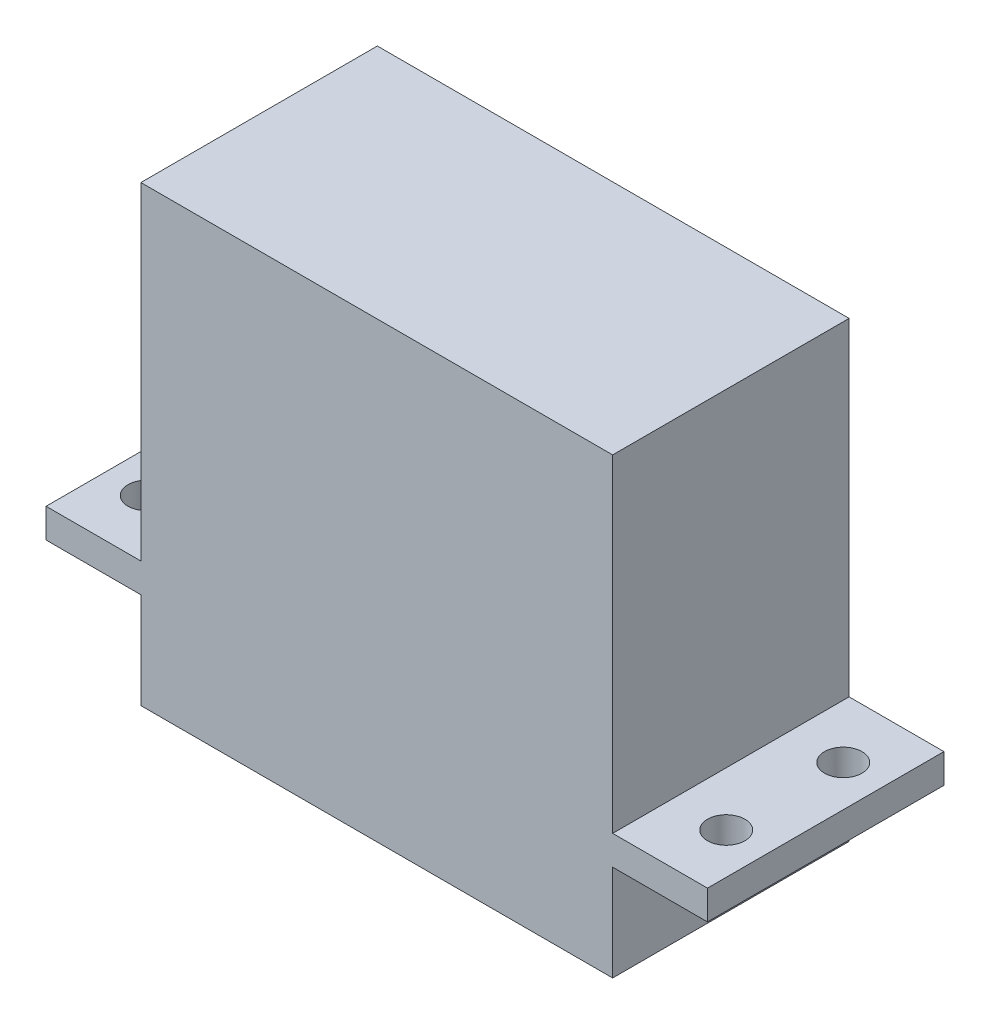
ISO-10303-21;
HEADER;
FILE_DESCRIPTION(('STEP AP214'),'2;1');
FILE_NAME('part.step','',(''),(''),'','','');
FILE_SCHEMA(('AUTOMOTIVE_DESIGN { 1 0 10303 214 1 1 1 1 }'));
ENDSEC;
DATA;
#1=APPLICATION_CONTEXT('core data for automotive mechanical design processes');
#2=APPLICATION_PROTOCOL_DEFINITION('international standard','automotive_design',2000,#1);
#3=PRODUCT_CONTEXT('',#1,'mechanical');
#4=PRODUCT('Part','Part','',(#3));
#5=PRODUCT_RELATED_PRODUCT_CATEGORY('part','',(#4));
#6=PRODUCT_DEFINITION_FORMATION('','',#4);
#7=PRODUCT_DEFINITION_CONTEXT('part definition',#1,'design');
#8=PRODUCT_DEFINITION('design','',#6,#7);
#9=PRODUCT_DEFINITION_SHAPE('','',#8);
#10=(LENGTH_UNIT() NAMED_UNIT(*) SI_UNIT(.MILLI.,.METRE.));
#11=(NAMED_UNIT(*) PLANE_ANGLE_UNIT() SI_UNIT($,.RADIAN.));
#12=(NAMED_UNIT(*) SI_UNIT($,.STERADIAN.) SOLID_ANGLE_UNIT());
#13=UNCERTAINTY_MEASURE_WITH_UNIT(LENGTH_MEASURE(1.E-05),#10,'distance_accuracy_value','');
#14=(GEOMETRIC_REPRESENTATION_CONTEXT(3) GLOBAL_UNCERTAINTY_ASSIGNED_CONTEXT((#13)) GLOBAL_UNIT_ASSIGNED_CONTEXT((#10,
#11,#12)) REPRESENTATION_CONTEXT('',''));
#15=CARTESIAN_POINT('',(0.,0.,0.));
#16=DIRECTION('',(0.,0.,1.));
#17=DIRECTION('',(1.,0.,0.));
#18=AXIS2_PLACEMENT_3D('',#15,#16,#17);
#19=CARTESIAN_POINT('',(-10.05,42.7,10.1));
#20=DIRECTION('',(1.,0.,0.));
#21=DIRECTION('',(0.,0.,-1.));
#22=AXIS2_PLACEMENT_3D('',#19,#20,#21);
#23=PLANE('',#22);
#24=DIRECTION('',(0.,0.,-1.));
#25=VECTOR('',#24,1.);
#26=CARTESIAN_POINT('',(-10.05,14.7,10.1));
#27=LINE('',#26,#25);
#28=CARTESIAN_POINT('',(-10.05,14.7,10.1));
#29=VERTEX_POINT('',#28);
#30=CARTESIAN_POINT('',(-10.05,14.7,-10.1));
#31=VERTEX_POINT('',#30);
#32=EDGE_CURVE('E157',#29,#31,#27,.T.);
#33=ORIENTED_EDGE('',*,*,#32,.F.);
#34=DIRECTION('',(0.,-1.,0.));
#35=VECTOR('',#34,1.);
#36=CARTESIAN_POINT('',(-10.05,42.7,10.1));
#37=LINE('',#36,#35);
#38=CARTESIAN_POINT('',(-10.05,42.7,10.1));
#39=VERTEX_POINT('',#38);
#40=EDGE_CURVE('E183',#39,#29,#37,.T.);
#41=ORIENTED_EDGE('',*,*,#40,.F.);
#42=DIRECTION('',(0.,0.,-1.));
#43=VECTOR('',#42,1.);
#44=CARTESIAN_POINT('',(-10.05,42.7,10.1));
#45=LINE('',#44,#43);
#46=CARTESIAN_POINT('',(-10.05,42.7,-10.1));
#47=VERTEX_POINT('',#46);
#48=EDGE_CURVE('E191',#39,#47,#45,.T.);
#49=ORIENTED_EDGE('',*,*,#48,.T.);
#50=DIRECTION('',(0.,-1.,0.));
#51=VECTOR('',#50,1.);
#52=CARTESIAN_POINT('',(-10.05,42.7,-10.1));
#53=LINE('',#52,#51);
#54=EDGE_CURVE('E160',#47,#31,#53,.T.);
#55=ORIENTED_EDGE('',*,*,#54,.T.);
#56=EDGE_LOOP('',(#33,#41,#49,#55));
#57=FACE_BOUND('',#56,.T.);
#58=ADVANCED_FACE('F41',(#57),#23,.F.);
#59=CARTESIAN_POINT('',(30.25,4.,10.1));
#60=DIRECTION('',(-1.,0.,0.));
#61=DIRECTION('',(0.,0.,1.));
#62=AXIS2_PLACEMENT_3D('',#59,#60,#61);
#63=PLANE('',#62);
#64=DIRECTION('',(0.,0.,-1.));
#65=VECTOR('',#64,1.);
#66=CARTESIAN_POINT('',(30.25,12.2,10.1));
#67=LINE('',#66,#65);
#68=CARTESIAN_POINT('',(30.25,12.2,10.1));
#69=VERTEX_POINT('',#68);
#70=CARTESIAN_POINT('',(30.25,12.2,-10.1));
#71=VERTEX_POINT('',#70);
#72=EDGE_CURVE('E162',#69,#71,#67,.T.);
#73=ORIENTED_EDGE('',*,*,#72,.F.);
#74=DIRECTION('',(0.,1.,0.));
#75=VECTOR('',#74,1.);
#76=CARTESIAN_POINT('',(30.25,4.,10.1));
#77=LINE('',#76,#75);
#78=CARTESIAN_POINT('',(30.25,4.,10.1));
#79=VERTEX_POINT('',#78);
#80=EDGE_CURVE('E192',#79,#69,#77,.T.);
#81=ORIENTED_EDGE('',*,*,#80,.F.);
#82=DIRECTION('',(0.,0.,-1.));
#83=VECTOR('',#82,1.);
#84=CARTESIAN_POINT('',(30.25,4.,10.1));
#85=LINE('',#84,#83);
#86=CARTESIAN_POINT('',(30.25,4.,-10.1));
#87=VERTEX_POINT('',#86);
#88=EDGE_CURVE('E49',#79,#87,#85,.T.);
#89=ORIENTED_EDGE('',*,*,#88,.T.);
#90=DIRECTION('',(0.,1.,0.));
#91=VECTOR('',#90,1.);
#92=CARTESIAN_POINT('',(30.25,4.,-10.1));
#93=LINE('',#92,#91);
#94=EDGE_CURVE('E203',#87,#71,#93,.T.);
#95=ORIENTED_EDGE('',*,*,#94,.T.);
#96=EDGE_LOOP('',(#73,#81,#89,#95));
#97=FACE_BOUND('',#96,.T.);
#98=ADVANCED_FACE('F278',(#97),#63,.F.);
#99=CARTESIAN_POINT('',(-10.05,12.2,10.1));
#100=VERTEX_POINT('',#99);
#101=CARTESIAN_POINT('',(-10.05,4.,10.1));
#102=VERTEX_POINT('',#101);
#103=EDGE_CURVE('E186',#100,#102,#37,.T.);
#104=ORIENTED_EDGE('',*,*,#103,.F.);
#105=DIRECTION('',(0.,0.,-1.));
#106=VECTOR('',#105,1.);
#107=CARTESIAN_POINT('',(-10.05,12.2,10.1));
#108=LINE('',#107,#106);
#109=CARTESIAN_POINT('',(-10.05,12.2,-10.1));
#110=VERTEX_POINT('',#109);
#111=EDGE_CURVE('E138',#100,#110,#108,.T.);
#112=ORIENTED_EDGE('',*,*,#111,.T.);
#113=CARTESIAN_POINT('',(-10.05,4.,-10.1));
#114=VERTEX_POINT('',#113);
#115=EDGE_CURVE('E154',#110,#114,#53,.T.);
#116=ORIENTED_EDGE('',*,*,#115,.T.);
#117=DIRECTION('',(0.,0.,-1.));
#118=VECTOR('',#117,1.);
#119=CARTESIAN_POINT('',(-10.05,4.,10.1));
#120=LINE('',#119,#118);
#121=EDGE_CURVE('E11',#102,#114,#120,.T.);
#122=ORIENTED_EDGE('',*,*,#121,.F.);
#123=EDGE_LOOP('',(#104,#112,#116,#122));
#124=FACE_BOUND('',#123,.T.);
#125=ADVANCED_FACE('F43',(#124),#23,.F.);
#126=CARTESIAN_POINT('',(-10.05,4.,10.1));
#127=DIRECTION('',(0.,1.,0.));
#128=DIRECTION('',(0.,0.,1.));
#129=AXIS2_PLACEMENT_3D('',#126,#127,#128);
#130=PLANE('',#129);
#131=CARTESIAN_POINT('',(0.,4.,0.));
#132=DIRECTION('',(0.,-1.,0.));
#133=DIRECTION('',(0.,0.,-1.));
#134=AXIS2_PLACEMENT_3D('',#131,#132,#133);
#135=CIRCLE('',#134,3.);
#136=CARTESIAN_POINT('',(0.,4.,-3.));
#137=VERTEX_POINT('',#136);
#138=EDGE_CURVE('E237',#137,#137,#135,.T.);
#139=ORIENTED_EDGE('',*,*,#138,.F.);
#140=EDGE_LOOP('',(#139));
#141=FACE_BOUND('',#140,.T.);
#142=DIRECTION('',(1.,0.,0.));
#143=VECTOR('',#142,1.);
#144=CARTESIAN_POINT('',(-10.05,4.,-10.1));
#145=LINE('',#144,#143);
#146=EDGE_CURVE('E196',#114,#87,#145,.T.);
#147=ORIENTED_EDGE('',*,*,#146,.T.);
#148=ORIENTED_EDGE('',*,*,#88,.F.);
#149=DIRECTION('',(1.,0.,0.));
#150=VECTOR('',#149,1.);
#151=CARTESIAN_POINT('',(-10.05,4.,10.1));
#152=LINE('',#151,#150);
#153=EDGE_CURVE('E190',#102,#79,#152,.T.);
#154=ORIENTED_EDGE('',*,*,#153,.F.);
#155=ORIENTED_EDGE('',*,*,#121,.T.);
#156=EDGE_LOOP('',(#147,#148,#154,#155));
#157=FACE_BOUND('',#156,.T.);
#158=ADVANCED_FACE('F282',(#141,#157),#130,.F.);
#159=CARTESIAN_POINT('',(30.25,14.7,10.1));
#160=VERTEX_POINT('',#159);
#161=CARTESIAN_POINT('',(30.25,42.7,10.1));
#162=VERTEX_POINT('',#161);
#163=EDGE_CURVE('E189',#160,#162,#77,.T.);
#164=ORIENTED_EDGE('',*,*,#163,.F.);
#165=DIRECTION('',(0.,0.,-1.));
#166=VECTOR('',#165,1.);
#167=CARTESIAN_POINT('',(30.25,14.7,10.1));
#168=LINE('',#167,#166);
#169=CARTESIAN_POINT('',(30.25,14.7,-10.1));
#170=VERTEX_POINT('',#169);
#171=EDGE_CURVE('E175',#160,#170,#168,.T.);
#172=ORIENTED_EDGE('',*,*,#171,.T.);
#173=CARTESIAN_POINT('',(30.25,42.7,-10.1));
#174=VERTEX_POINT('',#173);
#175=EDGE_CURVE('E199',#170,#174,#93,.T.);
#176=ORIENTED_EDGE('',*,*,#175,.T.);
#177=DIRECTION('',(0.,0.,-1.));
#178=VECTOR('',#177,1.);
#179=CARTESIAN_POINT('',(30.25,42.7,10.1));
#180=LINE('',#179,#178);
#181=EDGE_CURVE('E208',#162,#174,#180,.T.);
#182=ORIENTED_EDGE('',*,*,#181,.F.);
#183=EDGE_LOOP('',(#164,#172,#176,#182));
#184=FACE_BOUND('',#183,.T.);
#185=ADVANCED_FACE('F264',(#184),#63,.F.);
#186=CARTESIAN_POINT('',(30.25,42.7,10.1));
#187=DIRECTION('',(0.,-1.,0.));
#188=DIRECTION('',(0.,0.,-1.));
#189=AXIS2_PLACEMENT_3D('',#186,#187,#188);
#190=PLANE('',#189);
#191=DIRECTION('',(-1.,0.,0.));
#192=VECTOR('',#191,1.);
#193=CARTESIAN_POINT('',(30.25,42.7,-10.1));
#194=LINE('',#193,#192);
#195=EDGE_CURVE('E204',#174,#47,#194,.T.);
#196=ORIENTED_EDGE('',*,*,#195,.T.);
#197=ORIENTED_EDGE('',*,*,#48,.F.);
#198=DIRECTION('',(-1.,0.,0.));
#199=VECTOR('',#198,1.);
#200=CARTESIAN_POINT('',(30.25,42.7,10.1));
#201=LINE('',#200,#199);
#202=EDGE_CURVE('E194',#162,#39,#201,.T.);
#203=ORIENTED_EDGE('',*,*,#202,.F.);
#204=ORIENTED_EDGE('',*,*,#181,.T.);
#205=EDGE_LOOP('',(#196,#197,#203,#204));
#206=FACE_BOUND('',#205,.T.);
#207=ADVANCED_FACE('F259',(#206),#190,.F.);
#208=CARTESIAN_POINT('',(0.,0.,10.1));
#209=DIRECTION('',(0.,0.,1.));
#210=DIRECTION('',(1.,0.,0.));
#211=AXIS2_PLACEMENT_3D('',#208,#209,#210);
#212=PLANE('',#211);
#213=ORIENTED_EDGE('',*,*,#40,.T.);
#214=DIRECTION('',(-1.,0.,0.));
#215=VECTOR('',#214,1.);
#216=CARTESIAN_POINT('',(-10.05,14.7,10.1));
#217=LINE('',#216,#215);
#218=CARTESIAN_POINT('',(-18.15,14.7,10.1));
#219=VERTEX_POINT('',#218);
#220=EDGE_CURVE('E143',#29,#219,#217,.T.);
#221=ORIENTED_EDGE('',*,*,#220,.T.);
#222=DIRECTION('',(0.,-1.,0.));
#223=VECTOR('',#222,1.);
#224=CARTESIAN_POINT('',(-18.15,14.7,10.1));
#225=LINE('',#224,#223);
#226=CARTESIAN_POINT('',(-18.15,12.2,10.1));
#227=VERTEX_POINT('',#226);
#228=EDGE_CURVE('E142',#219,#227,#225,.T.);
#229=ORIENTED_EDGE('',*,*,#228,.T.);
#230=DIRECTION('',(1.,0.,0.));
#231=VECTOR('',#230,1.);
#232=CARTESIAN_POINT('',(-18.15,12.2,10.1));
#233=LINE('',#232,#231);
#234=EDGE_CURVE('E135',#227,#100,#233,.T.);
#235=ORIENTED_EDGE('',*,*,#234,.T.);
#236=ORIENTED_EDGE('',*,*,#103,.T.);
#237=ORIENTED_EDGE('',*,*,#153,.T.);
#238=ORIENTED_EDGE('',*,*,#80,.T.);
#239=DIRECTION('',(1.,0.,0.));
#240=VECTOR('',#239,1.);
#241=CARTESIAN_POINT('',(30.25,12.2,10.1));
#242=LINE('',#241,#240);
#243=CARTESIAN_POINT('',(38.35,12.2,10.1));
#244=VERTEX_POINT('',#243);
#245=EDGE_CURVE('E180',#69,#244,#242,.T.);
#246=ORIENTED_EDGE('',*,*,#245,.T.);
#247=DIRECTION('',(0.,1.,0.));
#248=VECTOR('',#247,1.);
#249=CARTESIAN_POINT('',(38.35,12.2,10.1));
#250=LINE('',#249,#248);
#251=CARTESIAN_POINT('',(38.35,14.7,10.1));
#252=VERTEX_POINT('',#251);
#253=EDGE_CURVE('E185',#244,#252,#250,.T.);
#254=ORIENTED_EDGE('',*,*,#253,.T.);
#255=DIRECTION('',(-1.,0.,0.));
#256=VECTOR('',#255,1.);
#257=CARTESIAN_POINT('',(38.35,14.7,10.1));
#258=LINE('',#257,#256);
#259=EDGE_CURVE('E172',#252,#160,#258,.T.);
#260=ORIENTED_EDGE('',*,*,#259,.T.);
#261=ORIENTED_EDGE('',*,*,#163,.T.);
#262=ORIENTED_EDGE('',*,*,#202,.T.);
#263=EDGE_LOOP('',(#213,#221,#229,#235,#236,#237,#238,#246,#254,#260,#261,#262));
#264=FACE_BOUND('',#263,.T.);
#265=ADVANCED_FACE('F148',(#264),#212,.T.);
#266=CARTESIAN_POINT('',(0.,0.,-10.1));
#267=DIRECTION('',(0.,0.,1.));
#268=DIRECTION('',(1.,0.,0.));
#269=AXIS2_PLACEMENT_3D('',#266,#267,#268);
#270=PLANE('',#269);
#271=ORIENTED_EDGE('',*,*,#54,.F.);
#272=ORIENTED_EDGE('',*,*,#195,.F.);
#273=ORIENTED_EDGE('',*,*,#175,.F.);
#274=DIRECTION('',(-1.,0.,0.));
#275=VECTOR('',#274,1.);
#276=CARTESIAN_POINT('',(38.35,14.7,-10.1));
#277=LINE('',#276,#275);
#278=CARTESIAN_POINT('',(38.35,14.7,-10.1));
#279=VERTEX_POINT('',#278);
#280=EDGE_CURVE('E67',#279,#170,#277,.T.);
#281=ORIENTED_EDGE('',*,*,#280,.F.);
#282=DIRECTION('',(0.,1.,0.));
#283=VECTOR('',#282,1.);
#284=CARTESIAN_POINT('',(38.35,12.2,-10.1));
#285=LINE('',#284,#283);
#286=CARTESIAN_POINT('',(38.35,12.2,-10.1));
#287=VERTEX_POINT('',#286);
#288=EDGE_CURVE('E177',#287,#279,#285,.T.);
#289=ORIENTED_EDGE('',*,*,#288,.F.);
#290=DIRECTION('',(1.,0.,0.));
#291=VECTOR('',#290,1.);
#292=CARTESIAN_POINT('',(30.25,12.2,-10.1));
#293=LINE('',#292,#291);
#294=EDGE_CURVE('E179',#71,#287,#293,.T.);
#295=ORIENTED_EDGE('',*,*,#294,.F.);
#296=ORIENTED_EDGE('',*,*,#94,.F.);
#297=ORIENTED_EDGE('',*,*,#146,.F.);
#298=ORIENTED_EDGE('',*,*,#115,.F.);
#299=DIRECTION('',(1.,0.,0.));
#300=VECTOR('',#299,1.);
#301=CARTESIAN_POINT('',(-18.15,12.2,-10.1));
#302=LINE('',#301,#300);
#303=CARTESIAN_POINT('',(-18.15,12.2,-10.1));
#304=VERTEX_POINT('',#303);
#305=EDGE_CURVE('E59',#304,#110,#302,.T.);
#306=ORIENTED_EDGE('',*,*,#305,.F.);
#307=DIRECTION('',(0.,-1.,0.));
#308=VECTOR('',#307,1.);
#309=CARTESIAN_POINT('',(-18.15,14.7,-10.1));
#310=LINE('',#309,#308);
#311=CARTESIAN_POINT('',(-18.15,14.7,-10.1));
#312=VERTEX_POINT('',#311);
#313=EDGE_CURVE('E152',#312,#304,#310,.T.);
#314=ORIENTED_EDGE('',*,*,#313,.F.);
#315=DIRECTION('',(-1.,0.,0.));
#316=VECTOR('',#315,1.);
#317=CARTESIAN_POINT('',(-10.05,14.7,-10.1));
#318=LINE('',#317,#316);
#319=EDGE_CURVE('E147',#31,#312,#318,.T.);
#320=ORIENTED_EDGE('',*,*,#319,.F.);
#321=EDGE_LOOP('',(#271,#272,#273,#281,#289,#295,#296,#297,#298,#306,#314,#320));
#322=FACE_BOUND('',#321,.T.);
#323=ADVANCED_FACE('F255',(#322),#270,.F.);
#324=CARTESIAN_POINT('',(30.25,12.2,10.1));
#325=DIRECTION('',(0.,1.,0.));
#326=DIRECTION('',(0.,0.,1.));
#327=AXIS2_PLACEMENT_3D('',#324,#325,#326);
#328=PLANE('',#327);
#329=CARTESIAN_POINT('',(34.85,12.2,5.));
#330=DIRECTION('',(0.,1.,0.));
#331=DIRECTION('',(0.,0.,1.));
#332=AXIS2_PLACEMENT_3D('',#329,#330,#331);
#333=CIRCLE('',#332,1.6);
#334=CARTESIAN_POINT('',(34.85,12.2,6.6));
#335=VERTEX_POINT('',#334);
#336=EDGE_CURVE('E233',#335,#335,#333,.T.);
#337=ORIENTED_EDGE('',*,*,#336,.T.);
#338=EDGE_LOOP('',(#337));
#339=FACE_BOUND('',#338,.T.);
#340=CARTESIAN_POINT('',(34.85,12.2,-5.));
#341=DIRECTION('',(0.,1.,0.));
#342=DIRECTION('',(0.,0.,1.));
#343=AXIS2_PLACEMENT_3D('',#340,#341,#342);
#344=CIRCLE('',#343,1.6);
#345=CARTESIAN_POINT('',(34.85,12.2,-3.4));
#346=VERTEX_POINT('',#345);
#347=EDGE_CURVE('E225',#346,#346,#344,.T.);
#348=ORIENTED_EDGE('',*,*,#347,.T.);
#349=EDGE_LOOP('',(#348));
#350=FACE_BOUND('',#349,.T.);
#351=ORIENTED_EDGE('',*,*,#294,.T.);
#352=DIRECTION('',(0.,0.,-1.));
#353=VECTOR('',#352,1.);
#354=CARTESIAN_POINT('',(38.35,12.2,10.1));
#355=LINE('',#354,#353);
#356=EDGE_CURVE('E167',#244,#287,#355,.T.);
#357=ORIENTED_EDGE('',*,*,#356,.F.);
#358=ORIENTED_EDGE('',*,*,#245,.F.);
#359=ORIENTED_EDGE('',*,*,#72,.T.);
#360=EDGE_LOOP('',(#351,#357,#358,#359));
#361=FACE_BOUND('',#360,.T.);
#362=ADVANCED_FACE('F280',(#339,#350,#361),#328,.F.);
#363=CARTESIAN_POINT('',(38.35,12.2,10.1));
#364=DIRECTION('',(-1.,0.,0.));
#365=DIRECTION('',(0.,0.,1.));
#366=AXIS2_PLACEMENT_3D('',#363,#364,#365);
#367=PLANE('',#366);
#368=ORIENTED_EDGE('',*,*,#288,.T.);
#369=DIRECTION('',(0.,0.,-1.));
#370=VECTOR('',#369,1.);
#371=CARTESIAN_POINT('',(38.35,14.7,10.1));
#372=LINE('',#371,#370);
#373=EDGE_CURVE('E168',#252,#279,#372,.T.);
#374=ORIENTED_EDGE('',*,*,#373,.F.);
#375=ORIENTED_EDGE('',*,*,#253,.F.);
#376=ORIENTED_EDGE('',*,*,#356,.T.);
#377=EDGE_LOOP('',(#368,#374,#375,#376));
#378=FACE_BOUND('',#377,.T.);
#379=ADVANCED_FACE('F275',(#378),#367,.F.);
#380=CARTESIAN_POINT('',(38.35,14.7,10.1));
#381=DIRECTION('',(0.,-1.,0.));
#382=DIRECTION('',(0.,0.,-1.));
#383=AXIS2_PLACEMENT_3D('',#380,#381,#382);
#384=PLANE('',#383);
#385=CARTESIAN_POINT('',(34.85,14.7,5.));
#386=DIRECTION('',(0.,-1.,0.));
#387=DIRECTION('',(0.,0.,-1.));
#388=AXIS2_PLACEMENT_3D('',#385,#386,#387);
#389=CIRCLE('',#388,1.6);
#390=CARTESIAN_POINT('',(34.85,14.7,3.4));
#391=VERTEX_POINT('',#390);
#392=EDGE_CURVE('E44',#391,#391,#389,.T.);
#393=ORIENTED_EDGE('',*,*,#392,.T.);
#394=EDGE_LOOP('',(#393));
#395=FACE_BOUND('',#394,.T.);
#396=CARTESIAN_POINT('',(34.85,14.7,-5.));
#397=DIRECTION('',(0.,-1.,0.));
#398=DIRECTION('',(0.,0.,-1.));
#399=AXIS2_PLACEMENT_3D('',#396,#397,#398);
#400=CIRCLE('',#399,1.6);
#401=CARTESIAN_POINT('',(34.85,14.7,-6.6));
#402=VERTEX_POINT('',#401);
#403=EDGE_CURVE('E219',#402,#402,#400,.T.);
#404=ORIENTED_EDGE('',*,*,#403,.T.);
#405=EDGE_LOOP('',(#404));
#406=FACE_BOUND('',#405,.T.);
#407=ORIENTED_EDGE('',*,*,#280,.T.);
#408=ORIENTED_EDGE('',*,*,#171,.F.);
#409=ORIENTED_EDGE('',*,*,#259,.F.);
#410=ORIENTED_EDGE('',*,*,#373,.T.);
#411=EDGE_LOOP('',(#407,#408,#409,#410));
#412=FACE_BOUND('',#411,.T.);
#413=ADVANCED_FACE('F270',(#395,#406,#412),#384,.F.);
#414=CARTESIAN_POINT('',(-18.15,14.7,10.1));
#415=DIRECTION('',(1.,0.,0.));
#416=DIRECTION('',(0.,0.,-1.));
#417=AXIS2_PLACEMENT_3D('',#414,#415,#416);
#418=PLANE('',#417);
#419=ORIENTED_EDGE('',*,*,#313,.T.);
#420=DIRECTION('',(0.,0.,-1.));
#421=VECTOR('',#420,1.);
#422=CARTESIAN_POINT('',(-18.15,12.2,10.1));
#423=LINE('',#422,#421);
#424=EDGE_CURVE('E137',#227,#304,#423,.T.);
#425=ORIENTED_EDGE('',*,*,#424,.F.);
#426=ORIENTED_EDGE('',*,*,#228,.F.);
#427=DIRECTION('',(0.,0.,-1.));
#428=VECTOR('',#427,1.);
#429=CARTESIAN_POINT('',(-18.15,14.7,10.1));
#430=LINE('',#429,#428);
#431=EDGE_CURVE('E245',#219,#312,#430,.T.);
#432=ORIENTED_EDGE('',*,*,#431,.T.);
#433=EDGE_LOOP('',(#419,#425,#426,#432));
#434=FACE_BOUND('',#433,.T.);
#435=ADVANCED_FACE('F155',(#434),#418,.F.);
#436=CARTESIAN_POINT('',(-18.15,12.2,10.1));
#437=DIRECTION('',(0.,1.,0.));
#438=DIRECTION('',(0.,0.,1.));
#439=AXIS2_PLACEMENT_3D('',#436,#437,#438);
#440=PLANE('',#439);
#441=CARTESIAN_POINT('',(-14.65,12.2,-5.));
#442=DIRECTION('',(0.,1.,0.));
#443=DIRECTION('',(0.,0.,1.));
#444=AXIS2_PLACEMENT_3D('',#441,#442,#443);
#445=CIRCLE('',#444,1.6);
#446=CARTESIAN_POINT('',(-14.65,12.2,-3.4));
#447=VERTEX_POINT('',#446);
#448=EDGE_CURVE('E218',#447,#447,#445,.T.);
#449=ORIENTED_EDGE('',*,*,#448,.T.);
#450=EDGE_LOOP('',(#449));
#451=FACE_BOUND('',#450,.T.);
#452=CARTESIAN_POINT('',(-14.65,12.2,5.));
#453=DIRECTION('',(0.,1.,0.));
#454=DIRECTION('',(0.,0.,1.));
#455=AXIS2_PLACEMENT_3D('',#452,#453,#454);
#456=CIRCLE('',#455,1.6);
#457=CARTESIAN_POINT('',(-14.65,12.2,6.6));
#458=VERTEX_POINT('',#457);
#459=EDGE_CURVE('E216',#458,#458,#456,.T.);
#460=ORIENTED_EDGE('',*,*,#459,.T.);
#461=EDGE_LOOP('',(#460));
#462=FACE_BOUND('',#461,.T.);
#463=ORIENTED_EDGE('',*,*,#305,.T.);
#464=ORIENTED_EDGE('',*,*,#111,.F.);
#465=ORIENTED_EDGE('',*,*,#234,.F.);
#466=ORIENTED_EDGE('',*,*,#424,.T.);
#467=EDGE_LOOP('',(#463,#464,#465,#466));
#468=FACE_BOUND('',#467,.T.);
#469=ADVANCED_FACE('F132',(#451,#462,#468),#440,.F.);
#470=CARTESIAN_POINT('',(-10.05,14.7,10.1));
#471=DIRECTION('',(0.,-1.,0.));
#472=DIRECTION('',(0.,0.,-1.));
#473=AXIS2_PLACEMENT_3D('',#470,#471,#472);
#474=PLANE('',#473);
#475=CARTESIAN_POINT('',(-14.65,14.7,-5.));
#476=DIRECTION('',(0.,-1.,0.));
#477=DIRECTION('',(0.,0.,-1.));
#478=AXIS2_PLACEMENT_3D('',#475,#476,#477);
#479=CIRCLE('',#478,1.6);
#480=CARTESIAN_POINT('',(-14.65,14.7,-6.6));
#481=VERTEX_POINT('',#480);
#482=EDGE_CURVE('E220',#481,#481,#479,.T.);
#483=ORIENTED_EDGE('',*,*,#482,.T.);
#484=EDGE_LOOP('',(#483));
#485=FACE_BOUND('',#484,.T.);
#486=CARTESIAN_POINT('',(-14.65,14.7,5.));
#487=DIRECTION('',(0.,-1.,0.));
#488=DIRECTION('',(0.,0.,-1.));
#489=AXIS2_PLACEMENT_3D('',#486,#487,#488);
#490=CIRCLE('',#489,1.6);
#491=CARTESIAN_POINT('',(-14.65,14.7,3.4));
#492=VERTEX_POINT('',#491);
#493=EDGE_CURVE('E213',#492,#492,#490,.T.);
#494=ORIENTED_EDGE('',*,*,#493,.T.);
#495=EDGE_LOOP('',(#494));
#496=FACE_BOUND('',#495,.T.);
#497=ORIENTED_EDGE('',*,*,#319,.T.);
#498=ORIENTED_EDGE('',*,*,#431,.F.);
#499=ORIENTED_EDGE('',*,*,#220,.F.);
#500=ORIENTED_EDGE('',*,*,#32,.T.);
#501=EDGE_LOOP('',(#497,#498,#499,#500));
#502=FACE_BOUND('',#501,.T.);
#503=ADVANCED_FACE('F249',(#485,#496,#502),#474,.F.);
#504=CARTESIAN_POINT('',(0.,0.,0.));
#505=DIRECTION('',(0.,-1.,0.));
#506=DIRECTION('',(0.,0.,-1.));
#507=AXIS2_PLACEMENT_3D('',#504,#505,#506);
#508=PLANE('',#507);
#509=CARTESIAN_POINT('',(0.,0.,0.));
#510=DIRECTION('',(0.,-1.,0.));
#511=DIRECTION('',(0.,0.,-1.));
#512=AXIS2_PLACEMENT_3D('',#509,#510,#511);
#513=CIRCLE('',#512,3.);
#514=CARTESIAN_POINT('',(0.,0.,-3.));
#515=VERTEX_POINT('',#514);
#516=EDGE_CURVE('E170',#515,#515,#513,.T.);
#517=ORIENTED_EDGE('',*,*,#516,.T.);
#518=EDGE_LOOP('',(#517));
#519=FACE_BOUND('',#518,.T.);
#520=ADVANCED_FACE('F359',(#519),#508,.T.);
#521=CARTESIAN_POINT('',(0.,-500.,0.));
#522=DIRECTION('',(0.,-1.,0.));
#523=DIRECTION('',(0.,0.,-1.));
#524=AXIS2_PLACEMENT_3D('',#521,#522,#523);
#525=CYLINDRICAL_SURFACE('',#524,3.);
#526=ORIENTED_EDGE('',*,*,#138,.T.);
#527=EDGE_LOOP('',(#526));
#528=FACE_BOUND('',#527,.T.);
#529=ORIENTED_EDGE('',*,*,#516,.F.);
#530=EDGE_LOOP('',(#529));
#531=FACE_BOUND('',#530,.T.);
#532=ADVANCED_FACE('F361',(#528,#531),#525,.T.);
#533=CARTESIAN_POINT('',(-14.65,-52.7,5.));
#534=DIRECTION('',(0.,1.,0.));
#535=DIRECTION('',(0.,0.,1.));
#536=AXIS2_PLACEMENT_3D('',#533,#534,#535);
#537=CYLINDRICAL_SURFACE('',#536,1.6);
#538=ORIENTED_EDGE('',*,*,#493,.F.);
#539=EDGE_LOOP('',(#538));
#540=FACE_BOUND('',#539,.T.);
#541=ORIENTED_EDGE('',*,*,#459,.F.);
#542=EDGE_LOOP('',(#541));
#543=FACE_BOUND('',#542,.T.);
#544=ADVANCED_FACE('F373',(#540,#543),#537,.F.);
#545=CARTESIAN_POINT('',(-14.65,-52.7,-5.));
#546=DIRECTION('',(0.,1.,0.));
#547=DIRECTION('',(0.,0.,1.));
#548=AXIS2_PLACEMENT_3D('',#545,#546,#547);
#549=CYLINDRICAL_SURFACE('',#548,1.6);
#550=ORIENTED_EDGE('',*,*,#482,.F.);
#551=EDGE_LOOP('',(#550));
#552=FACE_BOUND('',#551,.T.);
#553=ORIENTED_EDGE('',*,*,#448,.F.);
#554=EDGE_LOOP('',(#553));
#555=FACE_BOUND('',#554,.T.);
#556=ADVANCED_FACE('F413',(#552,#555),#549,.F.);
#557=CARTESIAN_POINT('',(34.85,-52.7,-5.));
#558=DIRECTION('',(0.,1.,0.));
#559=DIRECTION('',(0.,0.,1.));
#560=AXIS2_PLACEMENT_3D('',#557,#558,#559);
#561=CYLINDRICAL_SURFACE('',#560,1.6);
#562=ORIENTED_EDGE('',*,*,#403,.F.);
#563=EDGE_LOOP('',(#562));
#564=FACE_BOUND('',#563,.T.);
#565=ORIENTED_EDGE('',*,*,#347,.F.);
#566=EDGE_LOOP('',(#565));
#567=FACE_BOUND('',#566,.T.);
#568=ADVANCED_FACE('F425',(#564,#567),#561,.F.);
#569=CARTESIAN_POINT('',(34.85,-52.7,5.));
#570=DIRECTION('',(0.,1.,0.));
#571=DIRECTION('',(0.,0.,1.));
#572=AXIS2_PLACEMENT_3D('',#569,#570,#571);
#573=CYLINDRICAL_SURFACE('',#572,1.6);
#574=ORIENTED_EDGE('',*,*,#392,.F.);
#575=EDGE_LOOP('',(#574));
#576=FACE_BOUND('',#575,.T.);
#577=ORIENTED_EDGE('',*,*,#336,.F.);
#578=EDGE_LOOP('',(#577));
#579=FACE_BOUND('',#578,.T.);
#580=ADVANCED_FACE('F431',(#576,#579),#573,.F.);
#581=CLOSED_SHELL('',(#58,#98,#125,#158,#185,#207,#265,#323,#362,#379,#413,#435,#469,#503,#520,
#532,#544,#556,#568,#580));
#582=MANIFOLD_SOLID_BREP('B2',#581);
#583=ADVANCED_BREP_SHAPE_REPRESENTATION('',(#18,#582),#14);
#584=SHAPE_DEFINITION_REPRESENTATION(#9,#583);
ENDSEC;
END-ISO-10303-21;
